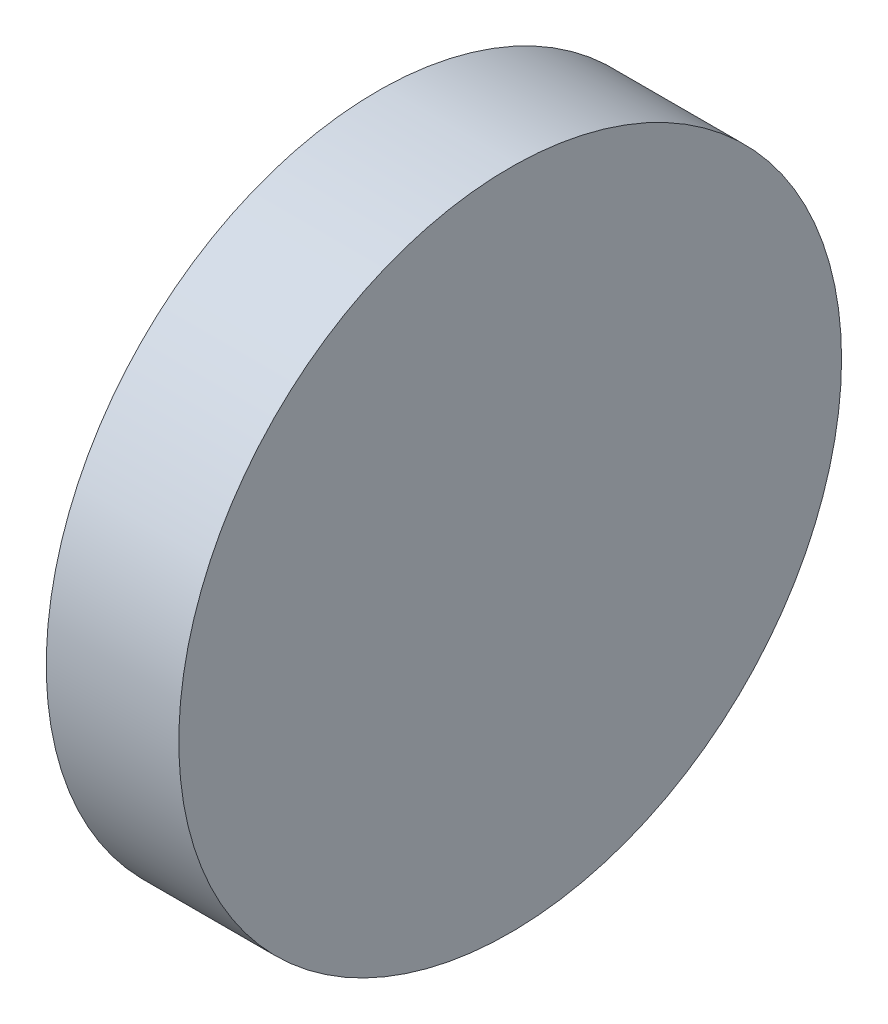
ISO-10303-21;
HEADER;
FILE_DESCRIPTION(('STEP AP214'),'2;1');
FILE_NAME('part.step','',(''),(''),'','','');
FILE_SCHEMA(('AUTOMOTIVE_DESIGN { 1 0 10303 214 1 1 1 1 }'));
ENDSEC;
DATA;
#1=APPLICATION_CONTEXT('core data for automotive mechanical design processes');
#2=APPLICATION_PROTOCOL_DEFINITION('international standard','automotive_design',2000,#1);
#3=PRODUCT_CONTEXT('',#1,'mechanical');
#4=PRODUCT('Part','Part','',(#3));
#5=PRODUCT_RELATED_PRODUCT_CATEGORY('part','',(#4));
#6=PRODUCT_DEFINITION_FORMATION('','',#4);
#7=PRODUCT_DEFINITION_CONTEXT('part definition',#1,'design');
#8=PRODUCT_DEFINITION('design','',#6,#7);
#9=PRODUCT_DEFINITION_SHAPE('','',#8);
#10=(LENGTH_UNIT() NAMED_UNIT(*) SI_UNIT(.MILLI.,.METRE.));
#11=(NAMED_UNIT(*) PLANE_ANGLE_UNIT() SI_UNIT($,.RADIAN.));
#12=(NAMED_UNIT(*) SI_UNIT($,.STERADIAN.) SOLID_ANGLE_UNIT());
#13=UNCERTAINTY_MEASURE_WITH_UNIT(LENGTH_MEASURE(1.E-05),#10,'distance_accuracy_value','');
#14=(GEOMETRIC_REPRESENTATION_CONTEXT(3) GLOBAL_UNCERTAINTY_ASSIGNED_CONTEXT((#13)) GLOBAL_UNIT_ASSIGNED_CONTEXT((#10,
#11,#12)) REPRESENTATION_CONTEXT('',''));
#15=CARTESIAN_POINT('',(0.,0.,0.));
#16=DIRECTION('',(0.,0.,1.));
#17=DIRECTION('',(1.,0.,0.));
#18=AXIS2_PLACEMENT_3D('',#15,#16,#17);
#19=CARTESIAN_POINT('',(2.,0.,0.));
#20=DIRECTION('',(-1.,0.,0.));
#21=DIRECTION('',(0.,0.,1.));
#22=AXIS2_PLACEMENT_3D('',#19,#20,#21);
#23=CYLINDRICAL_SURFACE('',#22,5.);
#24=CARTESIAN_POINT('',(2.,0.,0.));
#25=DIRECTION('',(1.,0.,0.));
#26=DIRECTION('',(0.,0.,-1.));
#27=AXIS2_PLACEMENT_3D('',#24,#25,#26);
#28=CIRCLE('',#27,5.);
#29=CARTESIAN_POINT('',(2.,0.,-5.));
#30=VERTEX_POINT('',#29);
#31=EDGE_CURVE('E10',#30,#30,#28,.T.);
#32=ORIENTED_EDGE('',*,*,#31,.F.);
#33=EDGE_LOOP('',(#32));
#34=FACE_BOUND('',#33,.T.);
#35=CARTESIAN_POINT('',(0.,0.,0.));
#36=DIRECTION('',(1.,0.,0.));
#37=DIRECTION('',(0.,0.,-1.));
#38=AXIS2_PLACEMENT_3D('',#35,#36,#37);
#39=CIRCLE('',#38,5.);
#40=CARTESIAN_POINT('',(0.,0.,-5.));
#41=VERTEX_POINT('',#40);
#42=EDGE_CURVE('E48',#41,#41,#39,.T.);
#43=ORIENTED_EDGE('',*,*,#42,.T.);
#44=EDGE_LOOP('',(#43));
#45=FACE_BOUND('',#44,.T.);
#46=ADVANCED_FACE('F45',(#34,#45),#23,.T.);
#47=CARTESIAN_POINT('',(2.,0.,0.));
#48=DIRECTION('',(1.,0.,0.));
#49=DIRECTION('',(0.,0.,-1.));
#50=AXIS2_PLACEMENT_3D('',#47,#48,#49);
#51=PLANE('',#50);
#52=ORIENTED_EDGE('',*,*,#31,.T.);
#53=EDGE_LOOP('',(#52));
#54=FACE_BOUND('',#53,.T.);
#55=ADVANCED_FACE('F128',(#54),#51,.T.);
#56=CARTESIAN_POINT('',(0.,0.,0.));
#57=DIRECTION('',(1.,0.,0.));
#58=DIRECTION('',(0.,0.,-1.));
#59=AXIS2_PLACEMENT_3D('',#56,#57,#58);
#60=PLANE('',#59);
#61=CARTESIAN_POINT('',(0.,0.,0.));
#62=DIRECTION('',(-1.,0.,0.));
#63=DIRECTION('',(0.,0.,1.));
#64=AXIS2_PLACEMENT_3D('',#61,#62,#63);
#65=CIRCLE('',#64,4.44242266495372);
#66=CARTESIAN_POINT('',(0.,0.,4.44242266495372));
#67=VERTEX_POINT('',#66);
#68=EDGE_CURVE('E57',#67,#67,#65,.T.);
#69=ORIENTED_EDGE('',*,*,#68,.F.);
#70=EDGE_LOOP('',(#69));
#71=FACE_BOUND('',#70,.T.);
#72=ORIENTED_EDGE('',*,*,#42,.F.);
#73=EDGE_LOOP('',(#72));
#74=FACE_BOUND('',#73,.T.);
#75=ADVANCED_FACE('F122',(#71,#74),#60,.F.);
#76=CARTESIAN_POINT('',(0.2,0.,0.));
#77=DIRECTION('',(-1.,0.,0.));
#78=DIRECTION('',(0.,0.,1.));
#79=AXIS2_PLACEMENT_3D('',#76,#77,#78);
#80=CYLINDRICAL_SURFACE('',#79,4.44242266495372);
#81=CARTESIAN_POINT('',(0.2,0.,0.));
#82=DIRECTION('',(-1.,0.,0.));
#83=DIRECTION('',(0.,0.,1.));
#84=AXIS2_PLACEMENT_3D('',#81,#82,#83);
#85=CIRCLE('',#84,4.44242266495372);
#86=CARTESIAN_POINT('',(0.2,0.,4.44242266495372));
#87=VERTEX_POINT('',#86);
#88=EDGE_CURVE('E55',#87,#87,#85,.T.);
#89=ORIENTED_EDGE('',*,*,#88,.F.);
#90=EDGE_LOOP('',(#89));
#91=FACE_BOUND('',#90,.T.);
#92=ORIENTED_EDGE('',*,*,#68,.T.);
#93=EDGE_LOOP('',(#92));
#94=FACE_BOUND('',#93,.T.);
#95=ADVANCED_FACE('F116',(#91,#94),#80,.F.);
#96=CARTESIAN_POINT('',(0.2,0.,0.));
#97=DIRECTION('',(-1.,0.,0.));
#98=DIRECTION('',(0.,0.,1.));
#99=AXIS2_PLACEMENT_3D('',#96,#97,#98);
#100=PLANE('',#99);
#101=CARTESIAN_POINT('',(0.2,0.,0.));
#102=DIRECTION('',(-1.,0.,0.));
#103=DIRECTION('',(0.,0.,1.));
#104=AXIS2_PLACEMENT_3D('',#101,#102,#103);
#105=CIRCLE('',#104,3.68296842592045);
#106=CARTESIAN_POINT('',(0.2,0.,3.68296842592045));
#107=VERTEX_POINT('',#106);
#108=EDGE_CURVE('E63',#107,#107,#105,.T.);
#109=ORIENTED_EDGE('',*,*,#108,.F.);
#110=EDGE_LOOP('',(#109));
#111=FACE_BOUND('',#110,.T.);
#112=ORIENTED_EDGE('',*,*,#88,.T.);
#113=EDGE_LOOP('',(#112));
#114=FACE_BOUND('',#113,.T.);
#115=ADVANCED_FACE('F110',(#111,#114),#100,.T.);
#116=CARTESIAN_POINT('',(0.,0.,0.));
#117=DIRECTION('',(1.,0.,0.));
#118=DIRECTION('',(0.,0.,-1.));
#119=AXIS2_PLACEMENT_3D('',#116,#117,#118);
#120=CYLINDRICAL_SURFACE('',#119,3.68296842592045);
#121=CARTESIAN_POINT('',(0.,0.,0.));
#122=DIRECTION('',(-1.,0.,0.));
#123=DIRECTION('',(0.,0.,1.));
#124=AXIS2_PLACEMENT_3D('',#121,#122,#123);
#125=CIRCLE('',#124,3.68296842592045);
#126=CARTESIAN_POINT('',(0.,0.,3.68296842592045));
#127=VERTEX_POINT('',#126);
#128=EDGE_CURVE('E60',#127,#127,#125,.T.);
#129=ORIENTED_EDGE('',*,*,#128,.F.);
#130=EDGE_LOOP('',(#129));
#131=FACE_BOUND('',#130,.T.);
#132=ORIENTED_EDGE('',*,*,#108,.T.);
#133=EDGE_LOOP('',(#132));
#134=FACE_BOUND('',#133,.T.);
#135=ADVANCED_FACE('F104',(#131,#134),#120,.T.);
#136=CARTESIAN_POINT('',(0.,0.,0.));
#137=DIRECTION('',(-1.,0.,0.));
#138=DIRECTION('',(0.,0.,1.));
#139=AXIS2_PLACEMENT_3D('',#136,#137,#138);
#140=PLANE('',#139);
#141=CARTESIAN_POINT('',(0.,0.,0.));
#142=DIRECTION('',(-1.,0.,0.));
#143=DIRECTION('',(0.,0.,1.));
#144=AXIS2_PLACEMENT_3D('',#141,#142,#143);
#145=CIRCLE('',#144,2.01865338001307);
#146=CARTESIAN_POINT('',(0.,0.,2.01865338001307));
#147=VERTEX_POINT('',#146);
#148=EDGE_CURVE('E69',#147,#147,#145,.T.);
#149=ORIENTED_EDGE('',*,*,#148,.F.);
#150=EDGE_LOOP('',(#149));
#151=FACE_BOUND('',#150,.T.);
#152=ORIENTED_EDGE('',*,*,#128,.T.);
#153=EDGE_LOOP('',(#152));
#154=FACE_BOUND('',#153,.T.);
#155=ADVANCED_FACE('F98',(#151,#154),#140,.T.);
#156=CARTESIAN_POINT('',(0.2,0.,0.));
#157=DIRECTION('',(-1.,0.,0.));
#158=DIRECTION('',(0.,0.,1.));
#159=AXIS2_PLACEMENT_3D('',#156,#157,#158);
#160=CYLINDRICAL_SURFACE('',#159,2.01865338001307);
#161=CARTESIAN_POINT('',(0.2,0.,0.));
#162=DIRECTION('',(-1.,0.,0.));
#163=DIRECTION('',(0.,0.,1.));
#164=AXIS2_PLACEMENT_3D('',#161,#162,#163);
#165=CIRCLE('',#164,2.01865338001307);
#166=CARTESIAN_POINT('',(0.2,0.,2.01865338001307));
#167=VERTEX_POINT('',#166);
#168=EDGE_CURVE('E66',#167,#167,#165,.T.);
#169=ORIENTED_EDGE('',*,*,#168,.F.);
#170=EDGE_LOOP('',(#169));
#171=FACE_BOUND('',#170,.T.);
#172=ORIENTED_EDGE('',*,*,#148,.T.);
#173=EDGE_LOOP('',(#172));
#174=FACE_BOUND('',#173,.T.);
#175=ADVANCED_FACE('F92',(#171,#174),#160,.F.);
#176=CARTESIAN_POINT('',(0.2,0.,0.));
#177=DIRECTION('',(-1.,0.,0.));
#178=DIRECTION('',(0.,0.,1.));
#179=AXIS2_PLACEMENT_3D('',#176,#177,#178);
#180=PLANE('',#179);
#181=CARTESIAN_POINT('',(0.2,0.,0.));
#182=DIRECTION('',(-1.,0.,0.));
#183=DIRECTION('',(0.,0.,1.));
#184=AXIS2_PLACEMENT_3D('',#181,#182,#183);
#185=CIRCLE('',#184,0.285545309095271);
#186=CARTESIAN_POINT('',(0.2,0.,0.285545309095271));
#187=VERTEX_POINT('',#186);
#188=EDGE_CURVE('E75',#187,#187,#185,.T.);
#189=ORIENTED_EDGE('',*,*,#188,.F.);
#190=EDGE_LOOP('',(#189));
#191=FACE_BOUND('',#190,.T.);
#192=ORIENTED_EDGE('',*,*,#168,.T.);
#193=EDGE_LOOP('',(#192));
#194=FACE_BOUND('',#193,.T.);
#195=ADVANCED_FACE('F86',(#191,#194),#180,.T.);
#196=CARTESIAN_POINT('',(0.6,0.,0.));
#197=DIRECTION('',(-1.,0.,0.));
#198=DIRECTION('',(0.,0.,1.));
#199=AXIS2_PLACEMENT_3D('',#196,#197,#198);
#200=CYLINDRICAL_SURFACE('',#199,0.285545309095271);
#201=CARTESIAN_POINT('',(0.6,0.,0.));
#202=DIRECTION('',(-1.,0.,0.));
#203=DIRECTION('',(0.,0.,1.));
#204=AXIS2_PLACEMENT_3D('',#201,#202,#203);
#205=CIRCLE('',#204,0.285545309095271);
#206=CARTESIAN_POINT('',(0.6,0.,0.285545309095271));
#207=VERTEX_POINT('',#206);
#208=EDGE_CURVE('E72',#207,#207,#205,.T.);
#209=ORIENTED_EDGE('',*,*,#208,.F.);
#210=EDGE_LOOP('',(#209));
#211=FACE_BOUND('',#210,.T.);
#212=ORIENTED_EDGE('',*,*,#188,.T.);
#213=EDGE_LOOP('',(#212));
#214=FACE_BOUND('',#213,.T.);
#215=ADVANCED_FACE('F83',(#211,#214),#200,.F.);
#216=CARTESIAN_POINT('',(0.6,0.,0.));
#217=DIRECTION('',(-1.,0.,0.));
#218=DIRECTION('',(0.,0.,1.));
#219=AXIS2_PLACEMENT_3D('',#216,#217,#218);
#220=PLANE('',#219);
#221=ORIENTED_EDGE('',*,*,#208,.T.);
#222=EDGE_LOOP('',(#221));
#223=FACE_BOUND('',#222,.T.);
#224=ADVANCED_FACE('F81',(#223),#220,.T.);
#225=CLOSED_SHELL('',(#46,#55,#75,#95,#115,#135,#155,#175,#195,#215,#224));
#226=MANIFOLD_SOLID_BREP('B2',#225);
#227=ADVANCED_BREP_SHAPE_REPRESENTATION('',(#18,#226),#14);
#228=SHAPE_DEFINITION_REPRESENTATION(#9,#227);
ENDSEC;
END-ISO-10303-21;
